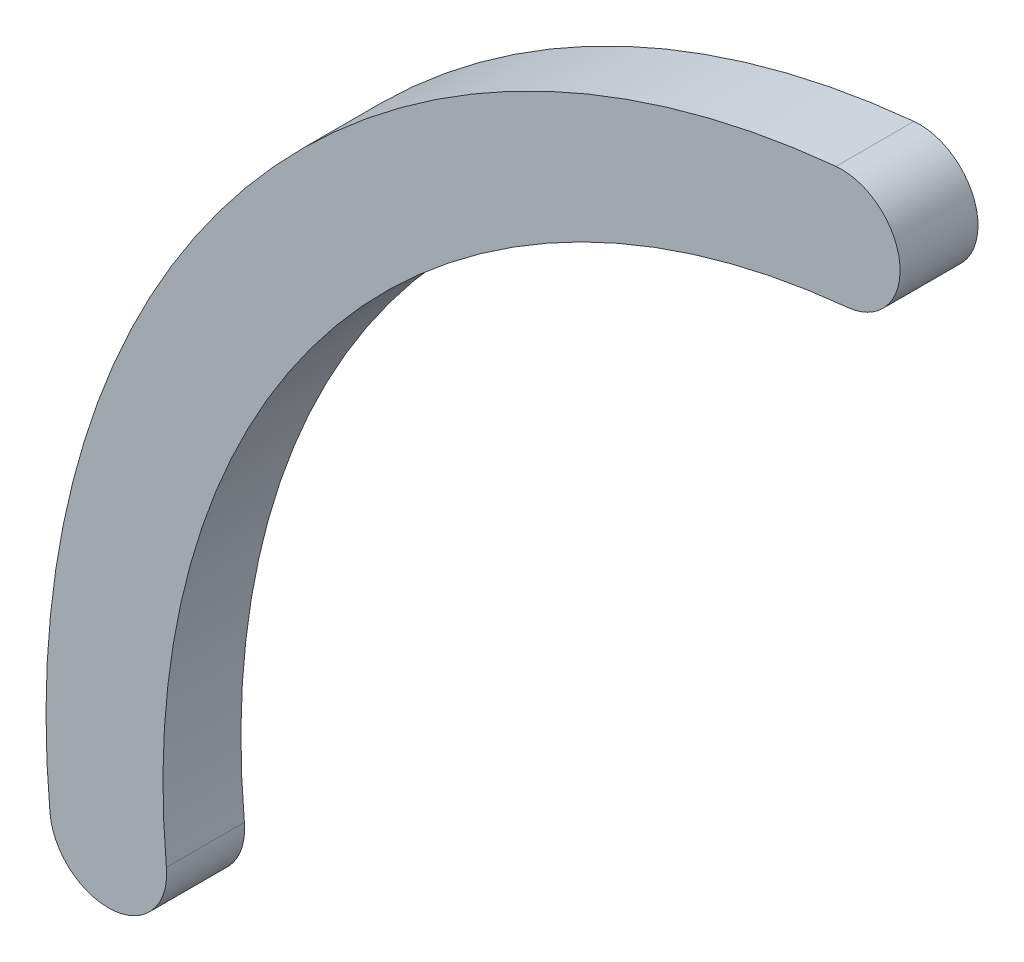
ISO-10303-21;
HEADER;
FILE_DESCRIPTION(('STEP AP214'),'2;1');
FILE_NAME('part.step','',(''),(''),'','','');
FILE_SCHEMA(('AUTOMOTIVE_DESIGN { 1 0 10303 214 1 1 1 1 }'));
ENDSEC;
DATA;
#1=APPLICATION_CONTEXT('core data for automotive mechanical design processes');
#2=APPLICATION_PROTOCOL_DEFINITION('international standard','automotive_design',2000,#1);
#3=PRODUCT_CONTEXT('',#1,'mechanical');
#4=PRODUCT('Part','Part','',(#3));
#5=PRODUCT_RELATED_PRODUCT_CATEGORY('part','',(#4));
#6=PRODUCT_DEFINITION_FORMATION('','',#4);
#7=PRODUCT_DEFINITION_CONTEXT('part definition',#1,'design');
#8=PRODUCT_DEFINITION('design','',#6,#7);
#9=PRODUCT_DEFINITION_SHAPE('','',#8);
#10=(LENGTH_UNIT() NAMED_UNIT(*) SI_UNIT(.MILLI.,.METRE.));
#11=(NAMED_UNIT(*) PLANE_ANGLE_UNIT() SI_UNIT($,.RADIAN.));
#12=(NAMED_UNIT(*) SI_UNIT($,.STERADIAN.) SOLID_ANGLE_UNIT());
#13=UNCERTAINTY_MEASURE_WITH_UNIT(LENGTH_MEASURE(1.E-05),#10,'distance_accuracy_value','');
#14=(GEOMETRIC_REPRESENTATION_CONTEXT(3) GLOBAL_UNCERTAINTY_ASSIGNED_CONTEXT((#13)) GLOBAL_UNIT_ASSIGNED_CONTEXT((#10,
#11,#12)) REPRESENTATION_CONTEXT('',''));
#15=CARTESIAN_POINT('',(0.,0.,0.));
#16=DIRECTION('',(0.,0.,1.));
#17=DIRECTION('',(1.,0.,0.));
#18=AXIS2_PLACEMENT_3D('',#15,#16,#17);
#19=CARTESIAN_POINT('',(-70.6854153019627,48.3905343394913,-5.82026108198921));
#20=DIRECTION('',(0.,0.,-1.));
#21=DIRECTION('',(-1.,0.,0.));
#22=AXIS2_PLACEMENT_3D('',#19,#20,#21);
#23=CYLINDRICAL_SURFACE('',#22,1.905);
#24=CARTESIAN_POINT('',(-70.6854153019627,48.3905343394913,-8.36026108198921));
#25=DIRECTION('',(0.,0.,1.));
#26=DIRECTION('',(1.,0.,0.));
#27=AXIS2_PLACEMENT_3D('',#24,#25,#26);
#28=CIRCLE('',#27,1.905);
#29=CARTESIAN_POINT('',(-72.5816818095816,48.208330244909,-8.36026108198921));
#30=VERTEX_POINT('',#29);
#31=CARTESIAN_POINT('',(-68.7891487943437,48.5727384340736,-8.36026108198921));
#32=VERTEX_POINT('',#31);
#33=EDGE_CURVE('E96',#30,#32,#28,.T.);
#34=ORIENTED_EDGE('',*,*,#33,.T.);
#35=DIRECTION('',(0.,0.,-1.));
#36=VECTOR('',#35,1.);
#37=CARTESIAN_POINT('',(-68.7891487943437,48.5727384340736,-5.82026108198921));
#38=LINE('',#37,#36);
#39=CARTESIAN_POINT('',(-68.7891487943437,48.5727384340736,-5.82026108198921));
#40=VERTEX_POINT('',#39);
#41=EDGE_CURVE('E11',#40,#32,#38,.T.);
#42=ORIENTED_EDGE('',*,*,#41,.F.);
#43=CARTESIAN_POINT('',(-70.6854153019627,48.3905343394913,-5.82026108198921));
#44=DIRECTION('',(0.,0.,1.));
#45=DIRECTION('',(1.,0.,0.));
#46=AXIS2_PLACEMENT_3D('',#43,#44,#45);
#47=CIRCLE('',#46,1.905);
#48=CARTESIAN_POINT('',(-72.5816818095816,48.208330244909,-5.82026108198921));
#49=VERTEX_POINT('',#48);
#50=EDGE_CURVE('E84',#49,#40,#47,.T.);
#51=ORIENTED_EDGE('',*,*,#50,.F.);
#52=DIRECTION('',(0.,0.,-1.));
#53=VECTOR('',#52,1.);
#54=CARTESIAN_POINT('',(-72.5816818095816,48.208330244909,-5.82026108198921));
#55=LINE('',#54,#53);
#56=EDGE_CURVE('E92',#49,#30,#55,.T.);
#57=ORIENTED_EDGE('',*,*,#56,.T.);
#58=EDGE_LOOP('',(#34,#42,#51,#57));
#59=FACE_BOUND('',#58,.T.);
#60=ADVANCED_FACE('F33',(#59),#23,.T.);
#61=CARTESIAN_POINT('',(-44.2504161019617,50.9305597394905,-5.82026108198921));
#62=DIRECTION('',(0.,0.,-1.));
#63=DIRECTION('',(-1.,0.,0.));
#64=AXIS2_PLACEMENT_3D('',#61,#62,#63);
#65=CYLINDRICAL_SURFACE('',#64,24.6517488924509);
#66=CARTESIAN_POINT('',(-44.2504161019617,50.9305597394905,-8.36026108198921));
#67=DIRECTION('',(0.,0.,-1.));
#68=DIRECTION('',(-1.,0.,0.));
#69=AXIS2_PLACEMENT_3D('',#66,#67,#68);
#70=CIRCLE('',#69,24.6517488924509);
#71=CARTESIAN_POINT('',(-46.6082374073802,75.4692924318723,-8.36026108198921));
#72=VERTEX_POINT('',#71);
#73=EDGE_CURVE('E88',#32,#72,#70,.T.);
#74=ORIENTED_EDGE('',*,*,#73,.T.);
#75=DIRECTION('',(0.,0.,-1.));
#76=VECTOR('',#75,1.);
#77=CARTESIAN_POINT('',(-46.6082374073802,75.4692924318723,-5.82026108198921));
#78=LINE('',#77,#76);
#79=CARTESIAN_POINT('',(-46.6082374073802,75.4692924318723,-5.82026108198921));
#80=VERTEX_POINT('',#79);
#81=EDGE_CURVE('E41',#80,#72,#78,.T.);
#82=ORIENTED_EDGE('',*,*,#81,.F.);
#83=CARTESIAN_POINT('',(-44.2504161019617,50.9305597394905,-5.82026108198921));
#84=DIRECTION('',(0.,0.,-1.));
#85=DIRECTION('',(-1.,0.,0.));
#86=AXIS2_PLACEMENT_3D('',#83,#84,#85);
#87=CIRCLE('',#86,24.6517488924509);
#88=EDGE_CURVE('E79',#40,#80,#87,.T.);
#89=ORIENTED_EDGE('',*,*,#88,.F.);
#90=ORIENTED_EDGE('',*,*,#41,.T.);
#91=EDGE_LOOP('',(#74,#82,#89,#90));
#92=FACE_BOUND('',#91,.T.);
#93=ADVANCED_FACE('F87',(#92),#65,.F.);
#94=CARTESIAN_POINT('',(-46.7904415019627,77.3655589394913,-5.82026108198921));
#95=DIRECTION('',(0.,0.,-1.));
#96=DIRECTION('',(-1.,0.,0.));
#97=AXIS2_PLACEMENT_3D('',#94,#95,#96);
#98=CYLINDRICAL_SURFACE('',#97,1.905);
#99=CARTESIAN_POINT('',(-46.7904415019627,77.3655589394913,-8.36026108198921));
#100=DIRECTION('',(0.,0.,1.));
#101=DIRECTION('',(-1.,0.,0.));
#102=AXIS2_PLACEMENT_3D('',#99,#100,#101);
#103=CIRCLE('',#102,1.905);
#104=CARTESIAN_POINT('',(-46.9726455965451,79.2618254471103,-8.36026108198921));
#105=VERTEX_POINT('',#104);
#106=EDGE_CURVE('E66',#72,#105,#103,.T.);
#107=ORIENTED_EDGE('',*,*,#106,.T.);
#108=DIRECTION('',(0.,0.,-1.));
#109=VECTOR('',#108,1.);
#110=CARTESIAN_POINT('',(-46.9726455965451,79.2618254471103,-5.82026108198921));
#111=LINE('',#110,#109);
#112=CARTESIAN_POINT('',(-46.9726455965451,79.2618254471103,-5.82026108198921));
#113=VERTEX_POINT('',#112);
#114=EDGE_CURVE('E89',#113,#105,#111,.T.);
#115=ORIENTED_EDGE('',*,*,#114,.F.);
#116=CARTESIAN_POINT('',(-46.7904415019627,77.3655589394913,-5.82026108198921));
#117=DIRECTION('',(0.,0.,1.));
#118=DIRECTION('',(-1.,0.,0.));
#119=AXIS2_PLACEMENT_3D('',#116,#117,#118);
#120=CIRCLE('',#119,1.905);
#121=EDGE_CURVE('E82',#80,#113,#120,.T.);
#122=ORIENTED_EDGE('',*,*,#121,.F.);
#123=ORIENTED_EDGE('',*,*,#81,.T.);
#124=EDGE_LOOP('',(#107,#115,#122,#123));
#125=FACE_BOUND('',#124,.T.);
#126=ADVANCED_FACE('F90',(#125),#98,.T.);
#127=CARTESIAN_POINT('',(-44.2504161019617,50.9305597394905,-5.82026108198921));
#128=DIRECTION('',(0.,0.,-1.));
#129=DIRECTION('',(-1.,0.,0.));
#130=AXIS2_PLACEMENT_3D('',#127,#128,#129);
#131=CYLINDRICAL_SURFACE('',#130,28.4617488924509);
#132=CARTESIAN_POINT('',(-44.2504161019617,50.9305597394905,-8.36026108198921));
#133=DIRECTION('',(0.,0.,1.));
#134=DIRECTION('',(-1.,0.,0.));
#135=AXIS2_PLACEMENT_3D('',#132,#133,#134);
#136=CIRCLE('',#135,28.4617488924509);
#137=EDGE_CURVE('E72',#105,#30,#136,.T.);
#138=ORIENTED_EDGE('',*,*,#137,.T.);
#139=ORIENTED_EDGE('',*,*,#56,.F.);
#140=CARTESIAN_POINT('',(-44.2504161019617,50.9305597394905,-5.82026108198921));
#141=DIRECTION('',(0.,0.,1.));
#142=DIRECTION('',(-1.,0.,0.));
#143=AXIS2_PLACEMENT_3D('',#140,#141,#142);
#144=CIRCLE('',#143,28.4617488924509);
#145=EDGE_CURVE('E49',#113,#49,#144,.T.);
#146=ORIENTED_EDGE('',*,*,#145,.F.);
#147=ORIENTED_EDGE('',*,*,#114,.T.);
#148=EDGE_LOOP('',(#138,#139,#146,#147));
#149=FACE_BOUND('',#148,.T.);
#150=ADVANCED_FACE('F103',(#149),#131,.T.);
#151=CARTESIAN_POINT('',(-57.4679157019622,49.6605470394909,-5.82026108198921));
#152=DIRECTION('',(0.,0.,1.));
#153=DIRECTION('',(1.,0.,0.));
#154=AXIS2_PLACEMENT_3D('',#151,#152,#153);
#155=PLANE('',#154);
#156=ORIENTED_EDGE('',*,*,#50,.T.);
#157=ORIENTED_EDGE('',*,*,#88,.T.);
#158=ORIENTED_EDGE('',*,*,#121,.T.);
#159=ORIENTED_EDGE('',*,*,#145,.T.);
#160=EDGE_LOOP('',(#156,#157,#158,#159));
#161=FACE_BOUND('',#160,.T.);
#162=ADVANCED_FACE('F80',(#161),#155,.T.);
#163=CARTESIAN_POINT('',(-57.4679157019622,49.6605470394909,-8.36026108198921));
#164=DIRECTION('',(0.,0.,1.));
#165=DIRECTION('',(1.,0.,0.));
#166=AXIS2_PLACEMENT_3D('',#163,#164,#165);
#167=PLANE('',#166);
#168=ORIENTED_EDGE('',*,*,#33,.F.);
#169=ORIENTED_EDGE('',*,*,#137,.F.);
#170=ORIENTED_EDGE('',*,*,#106,.F.);
#171=ORIENTED_EDGE('',*,*,#73,.F.);
#172=EDGE_LOOP('',(#168,#169,#170,#171));
#173=FACE_BOUND('',#172,.T.);
#174=ADVANCED_FACE('F106',(#173),#167,.F.);
#175=CLOSED_SHELL('',(#60,#93,#126,#150,#162,#174));
#176=MANIFOLD_SOLID_BREP('B2',#175);
#177=ADVANCED_BREP_SHAPE_REPRESENTATION('',(#18,#176),#14);
#178=SHAPE_DEFINITION_REPRESENTATION(#9,#177);
ENDSEC;
END-ISO-10303-21;
